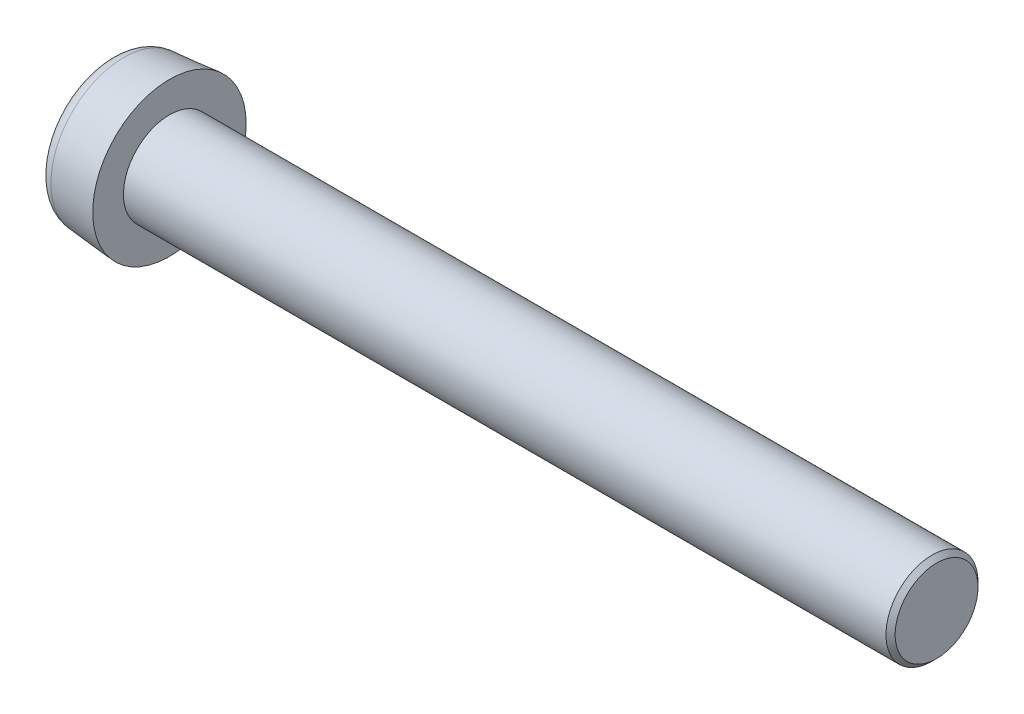
ISO-10303-21;
HEADER;
FILE_DESCRIPTION(('STEP AP214'),'2;1');
FILE_NAME('part.step','',(''),(''),'','','');
FILE_SCHEMA(('AUTOMOTIVE_DESIGN { 1 0 10303 214 1 1 1 1 }'));
ENDSEC;
DATA;
#1=APPLICATION_CONTEXT('core data for automotive mechanical design processes');
#2=APPLICATION_PROTOCOL_DEFINITION('international standard','automotive_design',2000,#1);
#3=PRODUCT_CONTEXT('',#1,'mechanical');
#4=PRODUCT('Part','Part','',(#3));
#5=PRODUCT_RELATED_PRODUCT_CATEGORY('part','',(#4));
#6=PRODUCT_DEFINITION_FORMATION('','',#4);
#7=PRODUCT_DEFINITION_CONTEXT('part definition',#1,'design');
#8=PRODUCT_DEFINITION('design','',#6,#7);
#9=PRODUCT_DEFINITION_SHAPE('','',#8);
#10=(LENGTH_UNIT() NAMED_UNIT(*) SI_UNIT(.MILLI.,.METRE.));
#11=(NAMED_UNIT(*) PLANE_ANGLE_UNIT() SI_UNIT($,.RADIAN.));
#12=(NAMED_UNIT(*) SI_UNIT($,.STERADIAN.) SOLID_ANGLE_UNIT());
#13=UNCERTAINTY_MEASURE_WITH_UNIT(LENGTH_MEASURE(1.E-05),#10,'distance_accuracy_value','');
#14=(GEOMETRIC_REPRESENTATION_CONTEXT(3) GLOBAL_UNCERTAINTY_ASSIGNED_CONTEXT((#13)) GLOBAL_UNIT_ASSIGNED_CONTEXT((#10,
#11,#12)) REPRESENTATION_CONTEXT('',''));
#15=CARTESIAN_POINT('',(0.,0.,0.));
#16=DIRECTION('',(0.,0.,1.));
#17=DIRECTION('',(1.,0.,0.));
#18=AXIS2_PLACEMENT_3D('',#15,#16,#17);
#19=CARTESIAN_POINT('',(0.,0.,0.));
#20=DIRECTION('',(1.,0.,0.));
#21=DIRECTION('',(0.,0.,-1.));
#22=AXIS2_PLACEMENT_3D('',#19,#20,#21);
#23=PLANE('',#22);
#24=CARTESIAN_POINT('',(0.,0.,0.));
#25=DIRECTION('',(1.,0.,0.));
#26=DIRECTION('',(0.,0.,-1.));
#27=AXIS2_PLACEMENT_3D('',#24,#25,#26);
#28=CIRCLE('',#27,3.74246303823147);
#29=CARTESIAN_POINT('',(0.,0.,-3.74246303823147));
#30=VERTEX_POINT('',#29);
#31=EDGE_CURVE('E138',#30,#30,#28,.F.);
#32=ORIENTED_EDGE('',*,*,#31,.T.);
#33=EDGE_LOOP('',(#32));
#34=FACE_BOUND('',#33,.T.);
#35=DIRECTION('',(0.,0.866025403784439,-0.5));
#36=VECTOR('',#35,1.);
#37=CARTESIAN_POINT('',(0.,-2.075,-1.19800180856848));
#38=LINE('',#37,#36);
#39=CARTESIAN_POINT('',(0.,-2.075,-1.19800180856848));
#40=VERTEX_POINT('',#39);
#41=CARTESIAN_POINT('',(0.,0.,-2.39600361713695));
#42=VERTEX_POINT('',#41);
#43=EDGE_CURVE('E54',#40,#42,#38,.T.);
#44=ORIENTED_EDGE('',*,*,#43,.T.);
#45=DIRECTION('',(0.,0.866025403784438,0.5));
#46=VECTOR('',#45,1.);
#47=CARTESIAN_POINT('',(0.,0.,-2.39600361713695));
#48=LINE('',#47,#46);
#49=CARTESIAN_POINT('',(0.,2.075,-1.19800180856847));
#50=VERTEX_POINT('',#49);
#51=EDGE_CURVE('E113',#42,#50,#48,.T.);
#52=ORIENTED_EDGE('',*,*,#51,.T.);
#53=DIRECTION('',(0.,0.,1.));
#54=VECTOR('',#53,1.);
#55=CARTESIAN_POINT('',(0.,2.075,-1.19800180856847));
#56=LINE('',#55,#54);
#57=CARTESIAN_POINT('',(0.,2.075,1.19800180856847));
#58=VERTEX_POINT('',#57);
#59=EDGE_CURVE('E111',#50,#58,#56,.T.);
#60=ORIENTED_EDGE('',*,*,#59,.T.);
#61=DIRECTION('',(0.,-0.866025403784438,0.5));
#62=VECTOR('',#61,1.);
#63=CARTESIAN_POINT('',(0.,2.075,1.19800180856847));
#64=LINE('',#63,#62);
#65=CARTESIAN_POINT('',(0.,0.,2.39600361713695));
#66=VERTEX_POINT('',#65);
#67=EDGE_CURVE('E90',#58,#66,#64,.T.);
#68=ORIENTED_EDGE('',*,*,#67,.T.);
#69=DIRECTION('',(0.,-0.866025403784438,-0.5));
#70=VECTOR('',#69,1.);
#71=CARTESIAN_POINT('',(0.,0.,2.39600361713695));
#72=LINE('',#71,#70);
#73=CARTESIAN_POINT('',(0.,-2.075,1.19800180856847));
#74=VERTEX_POINT('',#73);
#75=EDGE_CURVE('E101',#66,#74,#72,.T.);
#76=ORIENTED_EDGE('',*,*,#75,.T.);
#77=DIRECTION('',(0.,0.,-1.));
#78=VECTOR('',#77,1.);
#79=CARTESIAN_POINT('',(0.,-2.075,1.19800180856847));
#80=LINE('',#79,#78);
#81=EDGE_CURVE('E107',#74,#40,#80,.T.);
#82=ORIENTED_EDGE('',*,*,#81,.T.);
#83=EDGE_LOOP('',(#44,#52,#60,#68,#76,#82));
#84=FACE_BOUND('',#83,.T.);
#85=ADVANCED_FACE('F39',(#34,#84),#23,.F.);
#86=CARTESIAN_POINT('',(3.9,0.,0.));
#87=DIRECTION('',(1.,0.,0.));
#88=DIRECTION('',(0.,0.,-1.));
#89=AXIS2_PLACEMENT_3D('',#86,#87,#88);
#90=PLANE('',#89);
#91=CARTESIAN_POINT('',(3.9,0.,0.));
#92=DIRECTION('',(1.,0.,0.));
#93=DIRECTION('',(0.,0.,-1.));
#94=AXIS2_PLACEMENT_3D('',#91,#92,#93);
#95=CIRCLE('',#94,5.);
#96=CARTESIAN_POINT('',(3.9,0.,-5.));
#97=VERTEX_POINT('',#96);
#98=EDGE_CURVE('E131',#97,#97,#95,.T.);
#99=ORIENTED_EDGE('',*,*,#98,.T.);
#100=EDGE_LOOP('',(#99));
#101=FACE_BOUND('',#100,.T.);
#102=CARTESIAN_POINT('',(3.9,0.,0.));
#103=DIRECTION('',(1.,0.,0.));
#104=DIRECTION('',(0.,0.,-1.));
#105=AXIS2_PLACEMENT_3D('',#102,#103,#104);
#106=CIRCLE('',#105,3.);
#107=CARTESIAN_POINT('',(3.9,0.,-3.));
#108=VERTEX_POINT('',#107);
#109=EDGE_CURVE('E128',#108,#108,#106,.T.);
#110=ORIENTED_EDGE('',*,*,#109,.F.);
#111=EDGE_LOOP('',(#110));
#112=FACE_BOUND('',#111,.T.);
#113=ADVANCED_FACE('F155',(#101,#112),#90,.T.);
#114=CARTESIAN_POINT('',(3.9,0.,0.));
#115=DIRECTION('',(1.,0.,0.));
#116=DIRECTION('',(0.,0.,-1.));
#117=AXIS2_PLACEMENT_3D('',#114,#115,#116);
#118=CONICAL_SURFACE('',#117,5.,0.0872664625997167);
#119=CARTESIAN_POINT('',(0.912844257252342,0.,0.));
#120=DIRECTION('',(1.,0.,0.));
#121=DIRECTION('',(0.,0.,-1.));
#122=AXIS2_PLACEMENT_3D('',#119,#120,#121);
#123=CIRCLE('',#122,4.73865773632322);
#124=CARTESIAN_POINT('',(0.912844257252342,0.,-4.73865773632322));
#125=VERTEX_POINT('',#124);
#126=EDGE_CURVE('E135',#125,#125,#123,.T.);
#127=ORIENTED_EDGE('',*,*,#126,.T.);
#128=EDGE_LOOP('',(#127));
#129=FACE_BOUND('',#128,.T.);
#130=ORIENTED_EDGE('',*,*,#98,.F.);
#131=EDGE_LOOP('',(#130));
#132=FACE_BOUND('',#131,.T.);
#133=ADVANCED_FACE('F161',(#129,#132),#118,.T.);
#134=CARTESIAN_POINT('',(53.9,0.,0.));
#135=DIRECTION('',(-1.,0.,0.));
#136=DIRECTION('',(0.,0.,1.));
#137=AXIS2_PLACEMENT_3D('',#134,#135,#136);
#138=CYLINDRICAL_SURFACE('',#137,3.);
#139=CARTESIAN_POINT('',(53.6,0.,0.));
#140=DIRECTION('',(1.,0.,0.));
#141=DIRECTION('',(0.,0.,-1.));
#142=AXIS2_PLACEMENT_3D('',#139,#140,#141);
#143=CIRCLE('',#142,3.);
#144=CARTESIAN_POINT('',(53.6,0.,-3.));
#145=VERTEX_POINT('',#144);
#146=EDGE_CURVE('E11',#145,#145,#143,.F.);
#147=ORIENTED_EDGE('',*,*,#146,.T.);
#148=EDGE_LOOP('',(#147));
#149=FACE_BOUND('',#148,.T.);
#150=ORIENTED_EDGE('',*,*,#109,.T.);
#151=EDGE_LOOP('',(#150));
#152=FACE_BOUND('',#151,.T.);
#153=ADVANCED_FACE('F165',(#149,#152),#138,.T.);
#154=CARTESIAN_POINT('',(53.9,0.,0.));
#155=DIRECTION('',(1.,0.,0.));
#156=DIRECTION('',(0.,0.,-1.));
#157=AXIS2_PLACEMENT_3D('',#154,#155,#156);
#158=PLANE('',#157);
#159=CARTESIAN_POINT('',(53.9,0.,0.));
#160=DIRECTION('',(1.,0.,0.));
#161=DIRECTION('',(0.,0.,-1.));
#162=AXIS2_PLACEMENT_3D('',#159,#160,#161);
#163=CIRCLE('',#162,2.70000000000001);
#164=CARTESIAN_POINT('',(53.9,0.,-2.70000000000001));
#165=VERTEX_POINT('',#164);
#166=EDGE_CURVE('E47',#165,#165,#163,.T.);
#167=ORIENTED_EDGE('',*,*,#166,.T.);
#168=EDGE_LOOP('',(#167));
#169=FACE_BOUND('',#168,.T.);
#170=ADVANCED_FACE('F143',(#169),#158,.T.);
#171=CARTESIAN_POINT('',(2.,-2.075,-1.19800180856848));
#172=DIRECTION('',(0.,0.5,0.866025403784439));
#173=DIRECTION('',(0.,-0.866025403784439,0.5));
#174=AXIS2_PLACEMENT_3D('',#171,#172,#173);
#175=PLANE('',#174);
#176=ORIENTED_EDGE('',*,*,#43,.F.);
#177=DIRECTION('',(-1.,0.,0.));
#178=VECTOR('',#177,1.);
#179=CARTESIAN_POINT('',(2.,-2.075,-1.19800180856848));
#180=LINE('',#179,#178);
#181=CARTESIAN_POINT('',(2.,-2.075,-1.19800180856848));
#182=VERTEX_POINT('',#181);
#183=EDGE_CURVE('E119',#182,#40,#180,.T.);
#184=ORIENTED_EDGE('',*,*,#183,.F.);
#185=DIRECTION('',(0.,0.866025403784439,-0.5));
#186=VECTOR('',#185,1.);
#187=CARTESIAN_POINT('',(2.,-2.075,-1.19800180856848));
#188=LINE('',#187,#186);
#189=CARTESIAN_POINT('',(2.,0.,-2.39600361713695));
#190=VERTEX_POINT('',#189);
#191=EDGE_CURVE('E118',#182,#190,#188,.T.);
#192=ORIENTED_EDGE('',*,*,#191,.T.);
#193=DIRECTION('',(-1.,0.,0.));
#194=VECTOR('',#193,1.);
#195=CARTESIAN_POINT('',(2.,0.,-2.39600361713695));
#196=LINE('',#195,#194);
#197=EDGE_CURVE('E126',#190,#42,#196,.T.);
#198=ORIENTED_EDGE('',*,*,#197,.T.);
#199=EDGE_LOOP('',(#176,#184,#192,#198));
#200=FACE_BOUND('',#199,.T.);
#201=ADVANCED_FACE('F184',(#200),#175,.T.);
#202=CARTESIAN_POINT('',(2.,0.,-2.39600361713695));
#203=DIRECTION('',(0.,-0.5,0.866025403784438));
#204=DIRECTION('',(0.,-0.866025403784438,-0.5));
#205=AXIS2_PLACEMENT_3D('',#202,#203,#204);
#206=PLANE('',#205);
#207=ORIENTED_EDGE('',*,*,#51,.F.);
#208=ORIENTED_EDGE('',*,*,#197,.F.);
#209=DIRECTION('',(0.,0.866025403784438,0.5));
#210=VECTOR('',#209,1.);
#211=CARTESIAN_POINT('',(2.,0.,-2.39600361713695));
#212=LINE('',#211,#210);
#213=CARTESIAN_POINT('',(2.,2.075,-1.19800180856847));
#214=VERTEX_POINT('',#213);
#215=EDGE_CURVE('E257',#190,#214,#212,.T.);
#216=ORIENTED_EDGE('',*,*,#215,.T.);
#217=DIRECTION('',(-1.,0.,0.));
#218=VECTOR('',#217,1.);
#219=CARTESIAN_POINT('',(2.,2.075,-1.19800180856847));
#220=LINE('',#219,#218);
#221=EDGE_CURVE('E124',#214,#50,#220,.T.);
#222=ORIENTED_EDGE('',*,*,#221,.T.);
#223=EDGE_LOOP('',(#207,#208,#216,#222));
#224=FACE_BOUND('',#223,.T.);
#225=ADVANCED_FACE('F188',(#224),#206,.T.);
#226=CARTESIAN_POINT('',(2.,2.075,-1.19800180856847));
#227=DIRECTION('',(0.,-1.,0.));
#228=DIRECTION('',(0.,0.,-1.));
#229=AXIS2_PLACEMENT_3D('',#226,#227,#228);
#230=PLANE('',#229);
#231=ORIENTED_EDGE('',*,*,#59,.F.);
#232=ORIENTED_EDGE('',*,*,#221,.F.);
#233=DIRECTION('',(0.,0.,1.));
#234=VECTOR('',#233,1.);
#235=CARTESIAN_POINT('',(2.,2.075,-1.19800180856847));
#236=LINE('',#235,#234);
#237=CARTESIAN_POINT('',(2.,2.075,1.19800180856847));
#238=VERTEX_POINT('',#237);
#239=EDGE_CURVE('E63',#214,#238,#236,.T.);
#240=ORIENTED_EDGE('',*,*,#239,.T.);
#241=DIRECTION('',(-1.,0.,0.));
#242=VECTOR('',#241,1.);
#243=CARTESIAN_POINT('',(2.,2.075,1.19800180856847));
#244=LINE('',#243,#242);
#245=EDGE_CURVE('E97',#238,#58,#244,.T.);
#246=ORIENTED_EDGE('',*,*,#245,.T.);
#247=EDGE_LOOP('',(#231,#232,#240,#246));
#248=FACE_BOUND('',#247,.T.);
#249=ADVANCED_FACE('F193',(#248),#230,.T.);
#250=CARTESIAN_POINT('',(2.,2.075,1.19800180856847));
#251=DIRECTION('',(0.,-0.5,-0.866025403784438));
#252=DIRECTION('',(0.,0.866025403784439,-0.5));
#253=AXIS2_PLACEMENT_3D('',#250,#251,#252);
#254=PLANE('',#253);
#255=ORIENTED_EDGE('',*,*,#67,.F.);
#256=ORIENTED_EDGE('',*,*,#245,.F.);
#257=DIRECTION('',(0.,-0.866025403784438,0.5));
#258=VECTOR('',#257,1.);
#259=CARTESIAN_POINT('',(2.,2.075,1.19800180856847));
#260=LINE('',#259,#258);
#261=CARTESIAN_POINT('',(2.,0.,2.39600361713695));
#262=VERTEX_POINT('',#261);
#263=EDGE_CURVE('E94',#238,#262,#260,.T.);
#264=ORIENTED_EDGE('',*,*,#263,.T.);
#265=DIRECTION('',(-1.,0.,0.));
#266=VECTOR('',#265,1.);
#267=CARTESIAN_POINT('',(2.,0.,2.39600361713695));
#268=LINE('',#267,#266);
#269=EDGE_CURVE('E85',#262,#66,#268,.T.);
#270=ORIENTED_EDGE('',*,*,#269,.T.);
#271=EDGE_LOOP('',(#255,#256,#264,#270));
#272=FACE_BOUND('',#271,.T.);
#273=ADVANCED_FACE('F87',(#272),#254,.T.);
#274=CARTESIAN_POINT('',(2.,0.,2.39600361713695));
#275=DIRECTION('',(0.,0.5,-0.866025403784438));
#276=DIRECTION('',(0.,0.866025403784438,0.5));
#277=AXIS2_PLACEMENT_3D('',#274,#275,#276);
#278=PLANE('',#277);
#279=ORIENTED_EDGE('',*,*,#75,.F.);
#280=ORIENTED_EDGE('',*,*,#269,.F.);
#281=DIRECTION('',(0.,-0.866025403784438,-0.5));
#282=VECTOR('',#281,1.);
#283=CARTESIAN_POINT('',(2.,0.,2.39600361713695));
#284=LINE('',#283,#282);
#285=CARTESIAN_POINT('',(2.,-2.075,1.19800180856847));
#286=VERTEX_POINT('',#285);
#287=EDGE_CURVE('E232',#262,#286,#284,.T.);
#288=ORIENTED_EDGE('',*,*,#287,.T.);
#289=DIRECTION('',(-1.,0.,0.));
#290=VECTOR('',#289,1.);
#291=CARTESIAN_POINT('',(2.,-2.075,1.19800180856847));
#292=LINE('',#291,#290);
#293=EDGE_CURVE('E98',#286,#74,#292,.T.);
#294=ORIENTED_EDGE('',*,*,#293,.T.);
#295=EDGE_LOOP('',(#279,#280,#288,#294));
#296=FACE_BOUND('',#295,.T.);
#297=ADVANCED_FACE('F102',(#296),#278,.T.);
#298=CARTESIAN_POINT('',(2.,-2.075,1.19800180856847));
#299=DIRECTION('',(0.,1.,0.));
#300=DIRECTION('',(0.,0.,1.));
#301=AXIS2_PLACEMENT_3D('',#298,#299,#300);
#302=PLANE('',#301);
#303=ORIENTED_EDGE('',*,*,#81,.F.);
#304=ORIENTED_EDGE('',*,*,#293,.F.);
#305=DIRECTION('',(0.,0.,-1.));
#306=VECTOR('',#305,1.);
#307=CARTESIAN_POINT('',(2.,-2.075,1.19800180856847));
#308=LINE('',#307,#306);
#309=EDGE_CURVE('E121',#286,#182,#308,.T.);
#310=ORIENTED_EDGE('',*,*,#309,.T.);
#311=ORIENTED_EDGE('',*,*,#183,.T.);
#312=EDGE_LOOP('',(#303,#304,#310,#311));
#313=FACE_BOUND('',#312,.T.);
#314=ADVANCED_FACE('F202',(#313),#302,.T.);
#315=CARTESIAN_POINT('',(2.,0.,2.39600361713695));
#316=DIRECTION('',(0.86602540378444,-0.249999999999999,0.433012701892218));
#317=DIRECTION('',(0.447213595499956,0.,-0.894427190999917));
#318=AXIS2_PLACEMENT_3D('',#315,#316,#317);
#319=PLANE('',#318);
#320=ORIENTED_EDGE('',*,*,#287,.F.);
#321=DIRECTION('',(-0.447213595499956,0.,0.894427190999917));
#322=VECTOR('',#321,1.);
#323=CARTESIAN_POINT('',(2.,0.,2.39600361713695));
#324=LINE('',#323,#322);
#325=CARTESIAN_POINT('',(3.19800180856847,0.,0.));
#326=VERTEX_POINT('',#325);
#327=EDGE_CURVE('E234',#326,#262,#324,.T.);
#328=ORIENTED_EDGE('',*,*,#327,.F.);
#329=DIRECTION('',(-0.447213595499956,-0.774596669241484,0.447213595499958));
#330=VECTOR('',#329,1.);
#331=CARTESIAN_POINT('',(2.,-2.075,1.19800180856847));
#332=LINE('',#331,#330);
#333=EDGE_CURVE('E237',#326,#286,#332,.T.);
#334=ORIENTED_EDGE('',*,*,#333,.T.);
#335=EDGE_LOOP('',(#320,#328,#334));
#336=FACE_BOUND('',#335,.T.);
#337=ADVANCED_FACE('F205',(#336),#319,.F.);
#338=CARTESIAN_POINT('',(2.,-2.075,1.19800180856847));
#339=DIRECTION('',(0.86602540378444,-0.499999999999998,0.));
#340=DIRECTION('',(0.499999999999998,0.86602540378444,0.));
#341=AXIS2_PLACEMENT_3D('',#338,#339,#340);
#342=PLANE('',#341);
#343=ORIENTED_EDGE('',*,*,#309,.F.);
#344=ORIENTED_EDGE('',*,*,#333,.F.);
#345=DIRECTION('',(-0.447213595499956,-0.774596669241484,-0.447213595499958));
#346=VECTOR('',#345,1.);
#347=CARTESIAN_POINT('',(2.,-2.075,-1.19800180856848));
#348=LINE('',#347,#346);
#349=EDGE_CURVE('E261',#326,#182,#348,.T.);
#350=ORIENTED_EDGE('',*,*,#349,.T.);
#351=EDGE_LOOP('',(#343,#344,#350));
#352=FACE_BOUND('',#351,.T.);
#353=ADVANCED_FACE('F207',(#352),#342,.F.);
#354=CARTESIAN_POINT('',(2.,-2.075,-1.19800180856848));
#355=DIRECTION('',(0.86602540378444,-0.249999999999999,-0.433012701892218));
#356=DIRECTION('',(-0.447213595499956,0.,-0.894427190999917));
#357=AXIS2_PLACEMENT_3D('',#354,#355,#356);
#358=PLANE('',#357);
#359=ORIENTED_EDGE('',*,*,#191,.F.);
#360=ORIENTED_EDGE('',*,*,#349,.F.);
#361=DIRECTION('',(-0.447213595499956,0.,-0.894427190999917));
#362=VECTOR('',#361,1.);
#363=CARTESIAN_POINT('',(2.,0.,-2.39600361713695));
#364=LINE('',#363,#362);
#365=EDGE_CURVE('E269',#326,#190,#364,.T.);
#366=ORIENTED_EDGE('',*,*,#365,.T.);
#367=EDGE_LOOP('',(#359,#360,#366));
#368=FACE_BOUND('',#367,.T.);
#369=ADVANCED_FACE('F210',(#368),#358,.F.);
#370=CARTESIAN_POINT('',(2.,0.,-2.39600361713695));
#371=DIRECTION('',(0.86602540378444,0.249999999999999,-0.433012701892218));
#372=DIRECTION('',(-0.447213595499956,0.,-0.894427190999917));
#373=AXIS2_PLACEMENT_3D('',#370,#371,#372);
#374=PLANE('',#373);
#375=ORIENTED_EDGE('',*,*,#215,.F.);
#376=ORIENTED_EDGE('',*,*,#365,.F.);
#377=DIRECTION('',(-0.447213595499956,0.774596669241484,-0.447213595499958));
#378=VECTOR('',#377,1.);
#379=CARTESIAN_POINT('',(2.,2.075,-1.19800180856847));
#380=LINE('',#379,#378);
#381=EDGE_CURVE('E271',#326,#214,#380,.T.);
#382=ORIENTED_EDGE('',*,*,#381,.T.);
#383=EDGE_LOOP('',(#375,#376,#382));
#384=FACE_BOUND('',#383,.T.);
#385=ADVANCED_FACE('F214',(#384),#374,.F.);
#386=CARTESIAN_POINT('',(2.,2.075,-1.19800180856847));
#387=DIRECTION('',(0.86602540378444,0.499999999999998,0.));
#388=DIRECTION('',(-0.499999999999998,0.86602540378444,0.));
#389=AXIS2_PLACEMENT_3D('',#386,#387,#388);
#390=PLANE('',#389);
#391=ORIENTED_EDGE('',*,*,#239,.F.);
#392=ORIENTED_EDGE('',*,*,#381,.F.);
#393=DIRECTION('',(-0.447213595499956,0.774596669241484,0.447213595499958));
#394=VECTOR('',#393,1.);
#395=CARTESIAN_POINT('',(2.,2.075,1.19800180856847));
#396=LINE('',#395,#394);
#397=EDGE_CURVE('E265',#326,#238,#396,.T.);
#398=ORIENTED_EDGE('',*,*,#397,.T.);
#399=EDGE_LOOP('',(#391,#392,#398));
#400=FACE_BOUND('',#399,.T.);
#401=ADVANCED_FACE('F218',(#400),#390,.F.);
#402=CARTESIAN_POINT('',(2.,2.075,1.19800180856847));
#403=DIRECTION('',(0.86602540378444,0.249999999999999,0.433012701892218));
#404=DIRECTION('',(0.447213595499956,0.,-0.894427190999917));
#405=AXIS2_PLACEMENT_3D('',#402,#403,#404);
#406=PLANE('',#405);
#407=ORIENTED_EDGE('',*,*,#263,.F.);
#408=ORIENTED_EDGE('',*,*,#397,.F.);
#409=ORIENTED_EDGE('',*,*,#327,.T.);
#410=EDGE_LOOP('',(#407,#408,#409));
#411=FACE_BOUND('',#410,.T.);
#412=ADVANCED_FACE('F151',(#411),#406,.F.);
#413=CARTESIAN_POINT('',(1.,0.,0.));
#414=DIRECTION('',(1.,0.,0.));
#415=DIRECTION('',(0.,0.,-1.));
#416=AXIS2_PLACEMENT_3D('',#413,#414,#415);
#417=TOROIDAL_SURFACE('',#416,3.74246303823147,1.);
#418=ORIENTED_EDGE('',*,*,#31,.F.);
#419=EDGE_LOOP('',(#418));
#420=FACE_BOUND('',#419,.T.);
#421=ORIENTED_EDGE('',*,*,#126,.F.);
#422=EDGE_LOOP('',(#421));
#423=FACE_BOUND('',#422,.T.);
#424=ADVANCED_FACE('F146',(#420,#423),#417,.T.);
#425=CARTESIAN_POINT('',(53.9,0.,0.));
#426=DIRECTION('',(-1.,0.,0.));
#427=DIRECTION('',(0.,0.,1.));
#428=AXIS2_PLACEMENT_3D('',#425,#426,#427);
#429=CONICAL_SURFACE('',#428,2.70000000000001,0.785398163397445);
#430=ORIENTED_EDGE('',*,*,#146,.F.);
#431=EDGE_LOOP('',(#430));
#432=FACE_BOUND('',#431,.T.);
#433=ORIENTED_EDGE('',*,*,#166,.F.);
#434=EDGE_LOOP('',(#433));
#435=FACE_BOUND('',#434,.T.);
#436=ADVANCED_FACE('F41',(#432,#435),#429,.T.);
#437=CLOSED_SHELL('',(#85,#113,#133,#153,#170,#201,#225,#249,#273,#297,#314,#337,#353,#369,#385,
#401,#412,#424,#436));
#438=MANIFOLD_SOLID_BREP('B2',#437);
#439=ADVANCED_BREP_SHAPE_REPRESENTATION('',(#18,#438),#14);
#440=SHAPE_DEFINITION_REPRESENTATION(#9,#439);
ENDSEC;
END-ISO-10303-21;
